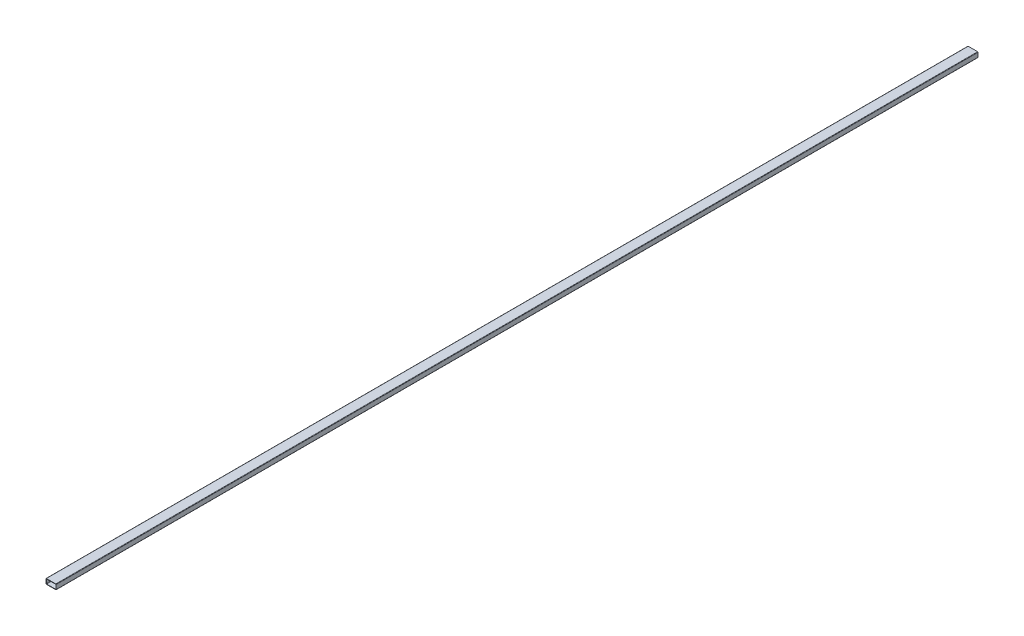
ISO-10303-21;
HEADER;
FILE_DESCRIPTION(('STEP AP214'),'2;1');
FILE_NAME('part.step','',(''),(''),'','','');
FILE_SCHEMA(('AUTOMOTIVE_DESIGN { 1 0 10303 214 1 1 1 1 }'));
ENDSEC;
DATA;
#1=APPLICATION_CONTEXT('core data for automotive mechanical design processes');
#2=APPLICATION_PROTOCOL_DEFINITION('international standard','automotive_design',2000,#1);
#3=PRODUCT_CONTEXT('',#1,'mechanical');
#4=PRODUCT('Part','Part','',(#3));
#5=PRODUCT_RELATED_PRODUCT_CATEGORY('part','',(#4));
#6=PRODUCT_DEFINITION_FORMATION('','',#4);
#7=PRODUCT_DEFINITION_CONTEXT('part definition',#1,'design');
#8=PRODUCT_DEFINITION('design','',#6,#7);
#9=PRODUCT_DEFINITION_SHAPE('','',#8);
#10=(LENGTH_UNIT() NAMED_UNIT(*) SI_UNIT(.MILLI.,.METRE.));
#11=(NAMED_UNIT(*) PLANE_ANGLE_UNIT() SI_UNIT($,.RADIAN.));
#12=(NAMED_UNIT(*) SI_UNIT($,.STERADIAN.) SOLID_ANGLE_UNIT());
#13=UNCERTAINTY_MEASURE_WITH_UNIT(LENGTH_MEASURE(1.E-05),#10,'distance_accuracy_value','');
#14=(GEOMETRIC_REPRESENTATION_CONTEXT(3) GLOBAL_UNCERTAINTY_ASSIGNED_CONTEXT((#13)) GLOBAL_UNIT_ASSIGNED_CONTEXT((#10,
#11,#12)) REPRESENTATION_CONTEXT('',''));
#15=CARTESIAN_POINT('',(0.,0.,0.));
#16=DIRECTION('',(0.,0.,1.));
#17=DIRECTION('',(1.,0.,0.));
#18=AXIS2_PLACEMENT_3D('',#15,#16,#17);
#19=CARTESIAN_POINT('',(18.4999999999996,-18.4999999999996,-3631.43888377231));
#20=DIRECTION('',(0.,0.,1.));
#21=DIRECTION('',(1.,0.,0.));
#22=AXIS2_PLACEMENT_3D('',#19,#20,#21);
#23=CYLINDRICAL_SURFACE('',#22,1.5);
#24=CARTESIAN_POINT('',(18.4999999999996,-18.4999999999996,0.));
#25=DIRECTION('',(0.,0.,1.));
#26=DIRECTION('',(-1.,0.,0.));
#27=AXIS2_PLACEMENT_3D('',#24,#25,#26);
#28=CIRCLE('',#27,1.5);
#29=CARTESIAN_POINT('',(18.4999999999996,-19.9999999999996,0.));
#30=VERTEX_POINT('',#29);
#31=CARTESIAN_POINT('',(19.9999999999996,-18.4999999999995,0.));
#32=VERTEX_POINT('',#31);
#33=EDGE_CURVE('E205',#30,#32,#28,.T.);
#34=ORIENTED_EDGE('',*,*,#33,.F.);
#35=DIRECTION('',(0.,0.,1.));
#36=VECTOR('',#35,1.);
#37=CARTESIAN_POINT('',(18.4999999999996,-19.9999999999996,-3631.43888377231));
#38=LINE('',#37,#36);
#39=CARTESIAN_POINT('',(18.4999999999996,-19.9999999999996,-3631.43888377231));
#40=VERTEX_POINT('',#39);
#41=EDGE_CURVE('E11',#40,#30,#38,.T.);
#42=ORIENTED_EDGE('',*,*,#41,.F.);
#43=CARTESIAN_POINT('',(18.4999999999996,-18.4999999999996,-3631.43888377231));
#44=DIRECTION('',(0.,0.,1.));
#45=DIRECTION('',(-1.,0.,0.));
#46=AXIS2_PLACEMENT_3D('',#43,#44,#45);
#47=CIRCLE('',#46,1.5);
#48=CARTESIAN_POINT('',(19.9999999999996,-18.4999999999995,-3631.43888377231));
#49=VERTEX_POINT('',#48);
#50=EDGE_CURVE('E217',#40,#49,#47,.T.);
#51=ORIENTED_EDGE('',*,*,#50,.T.);
#52=DIRECTION('',(0.,0.,1.));
#53=VECTOR('',#52,1.);
#54=CARTESIAN_POINT('',(19.9999999999996,-18.4999999999995,-3631.43888377231));
#55=LINE('',#54,#53);
#56=EDGE_CURVE('E38',#49,#32,#55,.T.);
#57=ORIENTED_EDGE('',*,*,#56,.T.);
#58=EDGE_LOOP('',(#34,#42,#51,#57));
#59=FACE_BOUND('',#58,.T.);
#60=ADVANCED_FACE('F35',(#59),#23,.T.);
#61=CARTESIAN_POINT('',(18.4999999999996,-19.9999999999996,-3631.43888377231));
#62=DIRECTION('',(0.,-1.,0.));
#63=DIRECTION('',(1.,0.,0.));
#64=AXIS2_PLACEMENT_3D('',#61,#62,#63);
#65=PLANE('',#64);
#66=DIRECTION('',(1.,0.,0.));
#67=VECTOR('',#66,1.);
#68=CARTESIAN_POINT('',(18.4999999999996,-19.9999999999996,0.));
#69=LINE('',#68,#67);
#70=CARTESIAN_POINT('',(-18.5000000000004,-19.9999999999996,0.));
#71=VERTEX_POINT('',#70);
#72=EDGE_CURVE('E221',#71,#30,#69,.T.);
#73=ORIENTED_EDGE('',*,*,#72,.F.);
#74=DIRECTION('',(0.,0.,1.));
#75=VECTOR('',#74,1.);
#76=CARTESIAN_POINT('',(-18.5000000000004,-19.9999999999996,-3631.43888377231));
#77=LINE('',#76,#75);
#78=CARTESIAN_POINT('',(-18.5000000000004,-19.9999999999996,-3631.43888377231));
#79=VERTEX_POINT('',#78);
#80=EDGE_CURVE('E43',#79,#71,#77,.T.);
#81=ORIENTED_EDGE('',*,*,#80,.F.);
#82=DIRECTION('',(1.,0.,0.));
#83=VECTOR('',#82,1.);
#84=CARTESIAN_POINT('',(18.4999999999996,-19.9999999999996,-3631.43888377231));
#85=LINE('',#84,#83);
#86=EDGE_CURVE('E239',#79,#40,#85,.T.);
#87=ORIENTED_EDGE('',*,*,#86,.T.);
#88=ORIENTED_EDGE('',*,*,#41,.T.);
#89=EDGE_LOOP('',(#73,#81,#87,#88));
#90=FACE_BOUND('',#89,.T.);
#91=ADVANCED_FACE('F286',(#90),#65,.T.);
#92=CARTESIAN_POINT('',(-18.5000000000004,-18.4999999999996,-3631.43888377231));
#93=DIRECTION('',(0.,0.,1.));
#94=DIRECTION('',(1.,0.,0.));
#95=AXIS2_PLACEMENT_3D('',#92,#93,#94);
#96=CYLINDRICAL_SURFACE('',#95,1.5);
#97=CARTESIAN_POINT('',(-18.5000000000004,-18.4999999999996,0.));
#98=DIRECTION('',(0.,0.,1.));
#99=DIRECTION('',(-1.,0.,0.));
#100=AXIS2_PLACEMENT_3D('',#97,#98,#99);
#101=CIRCLE('',#100,1.5);
#102=CARTESIAN_POINT('',(-20.0000000000004,-18.4999999999995,0.));
#103=VERTEX_POINT('',#102);
#104=EDGE_CURVE('E259',#103,#71,#101,.T.);
#105=ORIENTED_EDGE('',*,*,#104,.F.);
#106=DIRECTION('',(0.,0.,1.));
#107=VECTOR('',#106,1.);
#108=CARTESIAN_POINT('',(-20.0000000000004,-18.4999999999995,-3631.43888377231));
#109=LINE('',#108,#107);
#110=CARTESIAN_POINT('',(-20.0000000000004,-18.4999999999995,-3631.43888377231));
#111=VERTEX_POINT('',#110);
#112=EDGE_CURVE('E265',#111,#103,#109,.T.);
#113=ORIENTED_EDGE('',*,*,#112,.F.);
#114=CARTESIAN_POINT('',(-18.5000000000004,-18.4999999999996,-3631.43888377231));
#115=DIRECTION('',(0.,0.,1.));
#116=DIRECTION('',(-1.,0.,0.));
#117=AXIS2_PLACEMENT_3D('',#114,#115,#116);
#118=CIRCLE('',#117,1.5);
#119=EDGE_CURVE('E236',#111,#79,#118,.T.);
#120=ORIENTED_EDGE('',*,*,#119,.T.);
#121=ORIENTED_EDGE('',*,*,#80,.T.);
#122=EDGE_LOOP('',(#105,#113,#120,#121));
#123=FACE_BOUND('',#122,.T.);
#124=ADVANCED_FACE('F305',(#123),#96,.T.);
#125=CARTESIAN_POINT('',(-20.0000000000004,-1.49999999999955,-3631.43888377231));
#126=DIRECTION('',(-1.,0.,0.));
#127=DIRECTION('',(0.,0.,1.));
#128=AXIS2_PLACEMENT_3D('',#125,#126,#127);
#129=PLANE('',#128);
#130=DIRECTION('',(0.,-1.,0.));
#131=VECTOR('',#130,1.);
#132=CARTESIAN_POINT('',(-20.0000000000004,-1.49999999999955,0.));
#133=LINE('',#132,#131);
#134=CARTESIAN_POINT('',(-20.0000000000004,-1.49999999999955,0.));
#135=VERTEX_POINT('',#134);
#136=EDGE_CURVE('E256',#135,#103,#133,.T.);
#137=ORIENTED_EDGE('',*,*,#136,.F.);
#138=DIRECTION('',(0.,0.,1.));
#139=VECTOR('',#138,1.);
#140=CARTESIAN_POINT('',(-20.0000000000004,-1.49999999999955,-3631.43888377231));
#141=LINE('',#140,#139);
#142=CARTESIAN_POINT('',(-20.0000000000004,-1.49999999999955,-3631.43888377231));
#143=VERTEX_POINT('',#142);
#144=EDGE_CURVE('E267',#143,#135,#141,.T.);
#145=ORIENTED_EDGE('',*,*,#144,.F.);
#146=DIRECTION('',(0.,-1.,0.));
#147=VECTOR('',#146,1.);
#148=CARTESIAN_POINT('',(-20.0000000000004,-1.49999999999955,-3631.43888377231));
#149=LINE('',#148,#147);
#150=EDGE_CURVE('E233',#143,#111,#149,.T.);
#151=ORIENTED_EDGE('',*,*,#150,.T.);
#152=ORIENTED_EDGE('',*,*,#112,.T.);
#153=EDGE_LOOP('',(#137,#145,#151,#152));
#154=FACE_BOUND('',#153,.T.);
#155=ADVANCED_FACE('F303',(#154),#129,.T.);
#156=CARTESIAN_POINT('',(-18.5000000000004,-1.49999999999955,-3631.43888377231));
#157=DIRECTION('',(0.,0.,1.));
#158=DIRECTION('',(1.,0.,0.));
#159=AXIS2_PLACEMENT_3D('',#156,#157,#158);
#160=CYLINDRICAL_SURFACE('',#159,1.5);
#161=CARTESIAN_POINT('',(-18.5000000000004,-1.49999999999955,0.));
#162=DIRECTION('',(0.,0.,1.));
#163=DIRECTION('',(1.,0.,0.));
#164=AXIS2_PLACEMENT_3D('',#161,#162,#163);
#165=CIRCLE('',#164,1.5);
#166=CARTESIAN_POINT('',(-18.5000000000004,4.47558656802016E-13,0.));
#167=VERTEX_POINT('',#166);
#168=EDGE_CURVE('E253',#167,#135,#165,.T.);
#169=ORIENTED_EDGE('',*,*,#168,.F.);
#170=DIRECTION('',(0.,0.,1.));
#171=VECTOR('',#170,1.);
#172=CARTESIAN_POINT('',(-18.5000000000004,4.47558656802016E-13,-3631.43888377231));
#173=LINE('',#172,#171);
#174=CARTESIAN_POINT('',(-18.5000000000004,4.47558656802016E-13,-3631.43888377231));
#175=VERTEX_POINT('',#174);
#176=EDGE_CURVE('E269',#175,#167,#173,.T.);
#177=ORIENTED_EDGE('',*,*,#176,.F.);
#178=CARTESIAN_POINT('',(-18.5000000000004,-1.49999999999955,-3631.43888377231));
#179=DIRECTION('',(0.,0.,1.));
#180=DIRECTION('',(1.,0.,0.));
#181=AXIS2_PLACEMENT_3D('',#178,#179,#180);
#182=CIRCLE('',#181,1.5);
#183=EDGE_CURVE('E230',#175,#143,#182,.T.);
#184=ORIENTED_EDGE('',*,*,#183,.T.);
#185=ORIENTED_EDGE('',*,*,#144,.T.);
#186=EDGE_LOOP('',(#169,#177,#184,#185));
#187=FACE_BOUND('',#186,.T.);
#188=ADVANCED_FACE('F299',(#187),#160,.T.);
#189=CARTESIAN_POINT('',(18.4999999999996,4.54497550705923E-13,-3631.43888377231));
#190=DIRECTION('',(0.,1.,0.));
#191=DIRECTION('',(-1.,0.,0.));
#192=AXIS2_PLACEMENT_3D('',#189,#190,#191);
#193=PLANE('',#192);
#194=DIRECTION('',(-1.,0.,0.));
#195=VECTOR('',#194,1.);
#196=CARTESIAN_POINT('',(18.4999999999996,4.54497550705923E-13,0.));
#197=LINE('',#196,#195);
#198=CARTESIAN_POINT('',(18.4999999999996,4.54497550705923E-13,0.));
#199=VERTEX_POINT('',#198);
#200=EDGE_CURVE('E250',#199,#167,#197,.T.);
#201=ORIENTED_EDGE('',*,*,#200,.F.);
#202=DIRECTION('',(0.,0.,1.));
#203=VECTOR('',#202,1.);
#204=CARTESIAN_POINT('',(18.4999999999996,4.54497550705923E-13,-3631.43888377231));
#205=LINE('',#204,#203);
#206=CARTESIAN_POINT('',(18.4999999999996,4.54497550705923E-13,-3631.43888377231));
#207=VERTEX_POINT('',#206);
#208=EDGE_CURVE('E271',#207,#199,#205,.T.);
#209=ORIENTED_EDGE('',*,*,#208,.F.);
#210=DIRECTION('',(-1.,0.,0.));
#211=VECTOR('',#210,1.);
#212=CARTESIAN_POINT('',(18.4999999999996,4.54497550705923E-13,-3631.43888377231));
#213=LINE('',#212,#211);
#214=EDGE_CURVE('E227',#207,#175,#213,.T.);
#215=ORIENTED_EDGE('',*,*,#214,.T.);
#216=ORIENTED_EDGE('',*,*,#176,.T.);
#217=EDGE_LOOP('',(#201,#209,#215,#216));
#218=FACE_BOUND('',#217,.T.);
#219=ADVANCED_FACE('F297',(#218),#193,.T.);
#220=CARTESIAN_POINT('',(18.4999999999996,-1.49999999999955,-3631.43888377231));
#221=DIRECTION('',(0.,0.,1.));
#222=DIRECTION('',(1.,0.,0.));
#223=AXIS2_PLACEMENT_3D('',#220,#221,#222);
#224=CYLINDRICAL_SURFACE('',#223,1.50000000000001);
#225=CARTESIAN_POINT('',(18.4999999999996,-1.49999999999955,0.));
#226=DIRECTION('',(0.,0.,1.));
#227=DIRECTION('',(-1.,0.,0.));
#228=AXIS2_PLACEMENT_3D('',#225,#226,#227);
#229=CIRCLE('',#228,1.50000000000001);
#230=CARTESIAN_POINT('',(19.9999999999996,-1.49999999999955,0.));
#231=VERTEX_POINT('',#230);
#232=EDGE_CURVE('E247',#231,#199,#229,.T.);
#233=ORIENTED_EDGE('',*,*,#232,.F.);
#234=DIRECTION('',(0.,0.,1.));
#235=VECTOR('',#234,1.);
#236=CARTESIAN_POINT('',(19.9999999999996,-1.49999999999955,-3631.43888377231));
#237=LINE('',#236,#235);
#238=CARTESIAN_POINT('',(19.9999999999996,-1.49999999999955,-3631.43888377231));
#239=VERTEX_POINT('',#238);
#240=EDGE_CURVE('E272',#239,#231,#237,.T.);
#241=ORIENTED_EDGE('',*,*,#240,.F.);
#242=CARTESIAN_POINT('',(18.4999999999996,-1.49999999999955,-3631.43888377231));
#243=DIRECTION('',(0.,0.,1.));
#244=DIRECTION('',(-1.,0.,0.));
#245=AXIS2_PLACEMENT_3D('',#242,#243,#244);
#246=CIRCLE('',#245,1.50000000000001);
#247=EDGE_CURVE('E224',#239,#207,#246,.T.);
#248=ORIENTED_EDGE('',*,*,#247,.T.);
#249=ORIENTED_EDGE('',*,*,#208,.T.);
#250=EDGE_LOOP('',(#233,#241,#248,#249));
#251=FACE_BOUND('',#250,.T.);
#252=ADVANCED_FACE('F293',(#251),#224,.T.);
#253=CARTESIAN_POINT('',(19.9999999999996,-1.49999999999955,-3631.43888377231));
#254=DIRECTION('',(1.,0.,0.));
#255=DIRECTION('',(0.,0.,-1.));
#256=AXIS2_PLACEMENT_3D('',#253,#254,#255);
#257=PLANE('',#256);
#258=DIRECTION('',(0.,1.,0.));
#259=VECTOR('',#258,1.);
#260=CARTESIAN_POINT('',(19.9999999999996,-1.49999999999955,0.));
#261=LINE('',#260,#259);
#262=EDGE_CURVE('E244',#32,#231,#261,.T.);
#263=ORIENTED_EDGE('',*,*,#262,.F.);
#264=ORIENTED_EDGE('',*,*,#56,.F.);
#265=DIRECTION('',(0.,1.,0.));
#266=VECTOR('',#265,1.);
#267=CARTESIAN_POINT('',(19.9999999999996,-1.49999999999955,-3631.43888377231));
#268=LINE('',#267,#266);
#269=EDGE_CURVE('E220',#49,#239,#268,.T.);
#270=ORIENTED_EDGE('',*,*,#269,.T.);
#271=ORIENTED_EDGE('',*,*,#240,.T.);
#272=EDGE_LOOP('',(#263,#264,#270,#271));
#273=FACE_BOUND('',#272,.T.);
#274=ADVANCED_FACE('F280',(#273),#257,.T.);
#275=CARTESIAN_POINT('',(18.4999999999996,-18.4999999999996,-3631.43888377231));
#276=DIRECTION('',(0.,0.,-1.));
#277=DIRECTION('',(-1.,0.,0.));
#278=AXIS2_PLACEMENT_3D('',#275,#276,#277);
#279=PLANE('',#278);
#280=CARTESIAN_POINT('',(-17.5000000000004,-17.4999999999996,-3631.43888377231));
#281=DIRECTION('',(0.,0.,1.));
#282=DIRECTION('',(-1.,0.,0.));
#283=AXIS2_PLACEMENT_3D('',#280,#281,#282);
#284=CIRCLE('',#283,0.999999999999994);
#285=CARTESIAN_POINT('',(-18.5000000000004,-17.4999999999996,-3631.43888377231));
#286=VERTEX_POINT('',#285);
#287=CARTESIAN_POINT('',(-17.5000000000004,-18.4999999999996,-3631.43888377231));
#288=VERTEX_POINT('',#287);
#289=EDGE_CURVE('E150',#286,#288,#284,.T.);
#290=ORIENTED_EDGE('',*,*,#289,.T.);
#291=DIRECTION('',(1.,0.,0.));
#292=VECTOR('',#291,1.);
#293=CARTESIAN_POINT('',(17.4999999999996,-18.4999999999996,-3631.43888377231));
#294=LINE('',#293,#292);
#295=CARTESIAN_POINT('',(17.4999999999996,-18.4999999999996,-3631.43888377231));
#296=VERTEX_POINT('',#295);
#297=EDGE_CURVE('E159',#288,#296,#294,.T.);
#298=ORIENTED_EDGE('',*,*,#297,.T.);
#299=CARTESIAN_POINT('',(17.4999999999996,-17.4999999999996,-3631.43888377231));
#300=DIRECTION('',(0.,0.,1.));
#301=DIRECTION('',(-1.,0.,0.));
#302=AXIS2_PLACEMENT_3D('',#299,#300,#301);
#303=CIRCLE('',#302,1.);
#304=CARTESIAN_POINT('',(18.4999999999996,-17.4999999999996,-3631.43888377231));
#305=VERTEX_POINT('',#304);
#306=EDGE_CURVE('E51',#296,#305,#303,.T.);
#307=ORIENTED_EDGE('',*,*,#306,.T.);
#308=DIRECTION('',(0.,1.,0.));
#309=VECTOR('',#308,1.);
#310=CARTESIAN_POINT('',(18.4999999999996,-2.49999999999955,-3631.43888377231));
#311=LINE('',#310,#309);
#312=CARTESIAN_POINT('',(18.4999999999996,-2.49999999999955,-3631.43888377231));
#313=VERTEX_POINT('',#312);
#314=EDGE_CURVE('E174',#305,#313,#311,.T.);
#315=ORIENTED_EDGE('',*,*,#314,.T.);
#316=CARTESIAN_POINT('',(17.4999999999996,-2.49999999999955,-3631.43888377231));
#317=DIRECTION('',(0.,0.,1.));
#318=DIRECTION('',(-1.,0.,0.));
#319=AXIS2_PLACEMENT_3D('',#316,#317,#318);
#320=CIRCLE('',#319,1.);
#321=CARTESIAN_POINT('',(17.4999999999996,-1.49999999999955,-3631.43888377231));
#322=VERTEX_POINT('',#321);
#323=EDGE_CURVE('E177',#313,#322,#320,.T.);
#324=ORIENTED_EDGE('',*,*,#323,.T.);
#325=DIRECTION('',(-1.,0.,0.));
#326=VECTOR('',#325,1.);
#327=CARTESIAN_POINT('',(17.4999999999996,-1.49999999999955,-3631.43888377231));
#328=LINE('',#327,#326);
#329=CARTESIAN_POINT('',(-17.5000000000004,-1.49999999999956,-3631.43888377231));
#330=VERTEX_POINT('',#329);
#331=EDGE_CURVE('E180',#322,#330,#328,.T.);
#332=ORIENTED_EDGE('',*,*,#331,.T.);
#333=CARTESIAN_POINT('',(-17.5000000000004,-2.49999999999955,-3631.43888377231));
#334=DIRECTION('',(0.,0.,1.));
#335=DIRECTION('',(1.,0.,0.));
#336=AXIS2_PLACEMENT_3D('',#333,#334,#335);
#337=CIRCLE('',#336,0.999999999999997);
#338=CARTESIAN_POINT('',(-18.5000000000004,-2.49999999999955,-3631.43888377231));
#339=VERTEX_POINT('',#338);
#340=EDGE_CURVE('E183',#330,#339,#337,.T.);
#341=ORIENTED_EDGE('',*,*,#340,.T.);
#342=DIRECTION('',(0.,-1.,0.));
#343=VECTOR('',#342,1.);
#344=CARTESIAN_POINT('',(-18.5000000000004,-2.49999999999955,-3631.43888377231));
#345=LINE('',#344,#343);
#346=EDGE_CURVE('E156',#339,#286,#345,.T.);
#347=ORIENTED_EDGE('',*,*,#346,.T.);
#348=EDGE_LOOP('',(#290,#298,#307,#315,#324,#332,#341,#347));
#349=FACE_BOUND('',#348,.T.);
#350=ORIENTED_EDGE('',*,*,#50,.F.);
#351=ORIENTED_EDGE('',*,*,#86,.F.);
#352=ORIENTED_EDGE('',*,*,#119,.F.);
#353=ORIENTED_EDGE('',*,*,#150,.F.);
#354=ORIENTED_EDGE('',*,*,#183,.F.);
#355=ORIENTED_EDGE('',*,*,#214,.F.);
#356=ORIENTED_EDGE('',*,*,#247,.F.);
#357=ORIENTED_EDGE('',*,*,#269,.F.);
#358=EDGE_LOOP('',(#350,#351,#352,#353,#354,#355,#356,#357));
#359=FACE_BOUND('',#358,.T.);
#360=ADVANCED_FACE('F163',(#349,#359),#279,.T.);
#361=CARTESIAN_POINT('',(18.4999999999996,-18.4999999999996,0.));
#362=DIRECTION('',(0.,0.,-1.));
#363=DIRECTION('',(-1.,0.,0.));
#364=AXIS2_PLACEMENT_3D('',#361,#362,#363);
#365=PLANE('',#364);
#366=DIRECTION('',(1.,0.,0.));
#367=VECTOR('',#366,1.);
#368=CARTESIAN_POINT('',(17.4999999999996,-18.4999999999996,0.));
#369=LINE('',#368,#367);
#370=CARTESIAN_POINT('',(-17.5000000000004,-18.4999999999996,0.));
#371=VERTEX_POINT('',#370);
#372=CARTESIAN_POINT('',(17.4999999999996,-18.4999999999996,0.));
#373=VERTEX_POINT('',#372);
#374=EDGE_CURVE('E187',#371,#373,#369,.T.);
#375=ORIENTED_EDGE('',*,*,#374,.F.);
#376=CARTESIAN_POINT('',(-17.5000000000004,-17.4999999999996,0.));
#377=DIRECTION('',(0.,0.,1.));
#378=DIRECTION('',(-1.,0.,0.));
#379=AXIS2_PLACEMENT_3D('',#376,#377,#378);
#380=CIRCLE('',#379,0.999999999999994);
#381=CARTESIAN_POINT('',(-18.5000000000004,-17.4999999999996,0.));
#382=VERTEX_POINT('',#381);
#383=EDGE_CURVE('E59',#382,#371,#380,.T.);
#384=ORIENTED_EDGE('',*,*,#383,.F.);
#385=DIRECTION('',(0.,-1.,0.));
#386=VECTOR('',#385,1.);
#387=CARTESIAN_POINT('',(-18.5000000000004,-2.49999999999955,0.));
#388=LINE('',#387,#386);
#389=CARTESIAN_POINT('',(-18.5000000000004,-2.49999999999955,0.));
#390=VERTEX_POINT('',#389);
#391=EDGE_CURVE('E167',#390,#382,#388,.T.);
#392=ORIENTED_EDGE('',*,*,#391,.F.);
#393=CARTESIAN_POINT('',(-17.5000000000004,-2.49999999999955,0.));
#394=DIRECTION('',(0.,0.,1.));
#395=DIRECTION('',(1.,0.,0.));
#396=AXIS2_PLACEMENT_3D('',#393,#394,#395);
#397=CIRCLE('',#396,0.999999999999997);
#398=CARTESIAN_POINT('',(-17.5000000000004,-1.49999999999956,0.));
#399=VERTEX_POINT('',#398);
#400=EDGE_CURVE('E170',#399,#390,#397,.T.);
#401=ORIENTED_EDGE('',*,*,#400,.F.);
#402=DIRECTION('',(-1.,0.,0.));
#403=VECTOR('',#402,1.);
#404=CARTESIAN_POINT('',(17.4999999999996,-1.49999999999955,0.));
#405=LINE('',#404,#403);
#406=CARTESIAN_POINT('',(17.4999999999996,-1.49999999999955,0.));
#407=VERTEX_POINT('',#406);
#408=EDGE_CURVE('E198',#407,#399,#405,.T.);
#409=ORIENTED_EDGE('',*,*,#408,.F.);
#410=CARTESIAN_POINT('',(17.4999999999996,-2.49999999999955,0.));
#411=DIRECTION('',(0.,0.,1.));
#412=DIRECTION('',(-1.,0.,0.));
#413=AXIS2_PLACEMENT_3D('',#410,#411,#412);
#414=CIRCLE('',#413,1.);
#415=CARTESIAN_POINT('',(18.4999999999996,-2.49999999999955,0.));
#416=VERTEX_POINT('',#415);
#417=EDGE_CURVE('E195',#416,#407,#414,.T.);
#418=ORIENTED_EDGE('',*,*,#417,.F.);
#419=DIRECTION('',(0.,1.,0.));
#420=VECTOR('',#419,1.);
#421=CARTESIAN_POINT('',(18.4999999999996,-2.49999999999955,0.));
#422=LINE('',#421,#420);
#423=CARTESIAN_POINT('',(18.4999999999996,-17.4999999999996,0.));
#424=VERTEX_POINT('',#423);
#425=EDGE_CURVE('E192',#424,#416,#422,.T.);
#426=ORIENTED_EDGE('',*,*,#425,.F.);
#427=CARTESIAN_POINT('',(17.4999999999996,-17.4999999999996,0.));
#428=DIRECTION('',(0.,0.,1.));
#429=DIRECTION('',(-1.,0.,0.));
#430=AXIS2_PLACEMENT_3D('',#427,#428,#429);
#431=CIRCLE('',#430,1.);
#432=EDGE_CURVE('E189',#373,#424,#431,.T.);
#433=ORIENTED_EDGE('',*,*,#432,.F.);
#434=EDGE_LOOP('',(#375,#384,#392,#401,#409,#418,#426,#433));
#435=FACE_BOUND('',#434,.T.);
#436=ORIENTED_EDGE('',*,*,#33,.T.);
#437=ORIENTED_EDGE('',*,*,#262,.T.);
#438=ORIENTED_EDGE('',*,*,#232,.T.);
#439=ORIENTED_EDGE('',*,*,#200,.T.);
#440=ORIENTED_EDGE('',*,*,#168,.T.);
#441=ORIENTED_EDGE('',*,*,#136,.T.);
#442=ORIENTED_EDGE('',*,*,#104,.T.);
#443=ORIENTED_EDGE('',*,*,#72,.T.);
#444=EDGE_LOOP('',(#436,#437,#438,#439,#440,#441,#442,#443));
#445=FACE_BOUND('',#444,.T.);
#446=ADVANCED_FACE('F282',(#435,#445),#365,.F.);
#447=CARTESIAN_POINT('',(-17.5000000000004,-17.4999999999996,-3631.43888377231));
#448=DIRECTION('',(0.,0.,1.));
#449=DIRECTION('',(1.,0.,0.));
#450=AXIS2_PLACEMENT_3D('',#447,#448,#449);
#451=CYLINDRICAL_SURFACE('',#450,0.999999999999994);
#452=ORIENTED_EDGE('',*,*,#383,.T.);
#453=DIRECTION('',(0.,0.,1.));
#454=VECTOR('',#453,1.);
#455=CARTESIAN_POINT('',(-17.5000000000004,-18.4999999999996,-3631.43888377231));
#456=LINE('',#455,#454);
#457=EDGE_CURVE('E146',#288,#371,#456,.T.);
#458=ORIENTED_EDGE('',*,*,#457,.F.);
#459=ORIENTED_EDGE('',*,*,#289,.F.);
#460=DIRECTION('',(0.,0.,1.));
#461=VECTOR('',#460,1.);
#462=CARTESIAN_POINT('',(-18.5000000000004,-17.4999999999996,-3631.43888377231));
#463=LINE('',#462,#461);
#464=EDGE_CURVE('E203',#286,#382,#463,.T.);
#465=ORIENTED_EDGE('',*,*,#464,.T.);
#466=EDGE_LOOP('',(#452,#458,#459,#465));
#467=FACE_BOUND('',#466,.T.);
#468=ADVANCED_FACE('F148',(#467),#451,.F.);
#469=CARTESIAN_POINT('',(-18.5000000000004,-2.49999999999955,-3631.43888377231));
#470=DIRECTION('',(-1.,0.,0.));
#471=DIRECTION('',(0.,-1.,0.));
#472=AXIS2_PLACEMENT_3D('',#469,#470,#471);
#473=PLANE('',#472);
#474=ORIENTED_EDGE('',*,*,#391,.T.);
#475=ORIENTED_EDGE('',*,*,#464,.F.);
#476=ORIENTED_EDGE('',*,*,#346,.F.);
#477=DIRECTION('',(0.,0.,1.));
#478=VECTOR('',#477,1.);
#479=CARTESIAN_POINT('',(-18.5000000000004,-2.49999999999955,-3631.43888377231));
#480=LINE('',#479,#478);
#481=EDGE_CURVE('E206',#339,#390,#480,.T.);
#482=ORIENTED_EDGE('',*,*,#481,.T.);
#483=EDGE_LOOP('',(#474,#475,#476,#482));
#484=FACE_BOUND('',#483,.T.);
#485=ADVANCED_FACE('F388',(#484),#473,.F.);
#486=CARTESIAN_POINT('',(-17.5000000000004,-2.49999999999955,-3631.43888377231));
#487=DIRECTION('',(0.,0.,1.));
#488=DIRECTION('',(1.,0.,0.));
#489=AXIS2_PLACEMENT_3D('',#486,#487,#488);
#490=CYLINDRICAL_SURFACE('',#489,0.999999999999997);
#491=ORIENTED_EDGE('',*,*,#400,.T.);
#492=ORIENTED_EDGE('',*,*,#481,.F.);
#493=ORIENTED_EDGE('',*,*,#340,.F.);
#494=DIRECTION('',(0.,0.,1.));
#495=VECTOR('',#494,1.);
#496=CARTESIAN_POINT('',(-17.5000000000004,-1.49999999999956,-3631.43888377231));
#497=LINE('',#496,#495);
#498=EDGE_CURVE('E208',#330,#399,#497,.T.);
#499=ORIENTED_EDGE('',*,*,#498,.T.);
#500=EDGE_LOOP('',(#491,#492,#493,#499));
#501=FACE_BOUND('',#500,.T.);
#502=ADVANCED_FACE('F397',(#501),#490,.F.);
#503=CARTESIAN_POINT('',(17.4999999999996,-1.49999999999955,-3631.43888377231));
#504=DIRECTION('',(0.,1.,0.));
#505=DIRECTION('',(-1.,0.,0.));
#506=AXIS2_PLACEMENT_3D('',#503,#504,#505);
#507=PLANE('',#506);
#508=ORIENTED_EDGE('',*,*,#408,.T.);
#509=ORIENTED_EDGE('',*,*,#498,.F.);
#510=ORIENTED_EDGE('',*,*,#331,.F.);
#511=DIRECTION('',(0.,0.,1.));
#512=VECTOR('',#511,1.);
#513=CARTESIAN_POINT('',(17.4999999999996,-1.49999999999955,-3631.43888377231));
#514=LINE('',#513,#512);
#515=EDGE_CURVE('E210',#322,#407,#514,.T.);
#516=ORIENTED_EDGE('',*,*,#515,.T.);
#517=EDGE_LOOP('',(#508,#509,#510,#516));
#518=FACE_BOUND('',#517,.T.);
#519=ADVANCED_FACE('F407',(#518),#507,.F.);
#520=CARTESIAN_POINT('',(17.4999999999996,-2.49999999999955,-3631.43888377231));
#521=DIRECTION('',(0.,0.,1.));
#522=DIRECTION('',(1.,0.,0.));
#523=AXIS2_PLACEMENT_3D('',#520,#521,#522);
#524=CYLINDRICAL_SURFACE('',#523,1.);
#525=ORIENTED_EDGE('',*,*,#417,.T.);
#526=ORIENTED_EDGE('',*,*,#515,.F.);
#527=ORIENTED_EDGE('',*,*,#323,.F.);
#528=DIRECTION('',(0.,0.,1.));
#529=VECTOR('',#528,1.);
#530=CARTESIAN_POINT('',(18.4999999999996,-2.49999999999955,-3631.43888377231));
#531=LINE('',#530,#529);
#532=EDGE_CURVE('E212',#313,#416,#531,.T.);
#533=ORIENTED_EDGE('',*,*,#532,.T.);
#534=EDGE_LOOP('',(#525,#526,#527,#533));
#535=FACE_BOUND('',#534,.T.);
#536=ADVANCED_FACE('F417',(#535),#524,.F.);
#537=CARTESIAN_POINT('',(18.4999999999996,-2.49999999999955,-3631.43888377231));
#538=DIRECTION('',(1.,0.,0.));
#539=DIRECTION('',(0.,1.,0.));
#540=AXIS2_PLACEMENT_3D('',#537,#538,#539);
#541=PLANE('',#540);
#542=ORIENTED_EDGE('',*,*,#425,.T.);
#543=ORIENTED_EDGE('',*,*,#532,.F.);
#544=ORIENTED_EDGE('',*,*,#314,.F.);
#545=DIRECTION('',(0.,0.,1.));
#546=VECTOR('',#545,1.);
#547=CARTESIAN_POINT('',(18.4999999999996,-17.4999999999996,-3631.43888377231));
#548=LINE('',#547,#546);
#549=EDGE_CURVE('E214',#305,#424,#548,.T.);
#550=ORIENTED_EDGE('',*,*,#549,.T.);
#551=EDGE_LOOP('',(#542,#543,#544,#550));
#552=FACE_BOUND('',#551,.T.);
#553=ADVANCED_FACE('F427',(#552),#541,.F.);
#554=CARTESIAN_POINT('',(17.4999999999996,-17.4999999999996,-3631.43888377231));
#555=DIRECTION('',(0.,0.,1.));
#556=DIRECTION('',(1.,0.,0.));
#557=AXIS2_PLACEMENT_3D('',#554,#555,#556);
#558=CYLINDRICAL_SURFACE('',#557,1.);
#559=ORIENTED_EDGE('',*,*,#432,.T.);
#560=ORIENTED_EDGE('',*,*,#549,.F.);
#561=ORIENTED_EDGE('',*,*,#306,.F.);
#562=DIRECTION('',(0.,0.,1.));
#563=VECTOR('',#562,1.);
#564=CARTESIAN_POINT('',(17.4999999999996,-18.4999999999996,-3631.43888377231));
#565=LINE('',#564,#563);
#566=EDGE_CURVE('E155',#296,#373,#565,.T.);
#567=ORIENTED_EDGE('',*,*,#566,.T.);
#568=EDGE_LOOP('',(#559,#560,#561,#567));
#569=FACE_BOUND('',#568,.T.);
#570=ADVANCED_FACE('F437',(#569),#558,.F.);
#571=CARTESIAN_POINT('',(17.4999999999996,-18.4999999999996,-3631.43888377231));
#572=DIRECTION('',(0.,-1.,0.));
#573=DIRECTION('',(1.,0.,0.));
#574=AXIS2_PLACEMENT_3D('',#571,#572,#573);
#575=PLANE('',#574);
#576=ORIENTED_EDGE('',*,*,#374,.T.);
#577=ORIENTED_EDGE('',*,*,#566,.F.);
#578=ORIENTED_EDGE('',*,*,#297,.F.);
#579=ORIENTED_EDGE('',*,*,#457,.T.);
#580=EDGE_LOOP('',(#576,#577,#578,#579));
#581=FACE_BOUND('',#580,.T.);
#582=ADVANCED_FACE('F160',(#581),#575,.F.);
#583=CLOSED_SHELL('',(#60,#91,#124,#155,#188,#219,#252,#274,#360,#446,#468,#485,#502,#519,#536,
#553,#570,#582));
#584=MANIFOLD_SOLID_BREP('B2',#583);
#585=ADVANCED_BREP_SHAPE_REPRESENTATION('',(#18,#584),#14);
#586=SHAPE_DEFINITION_REPRESENTATION(#9,#585);
ENDSEC;
END-ISO-10303-21;
